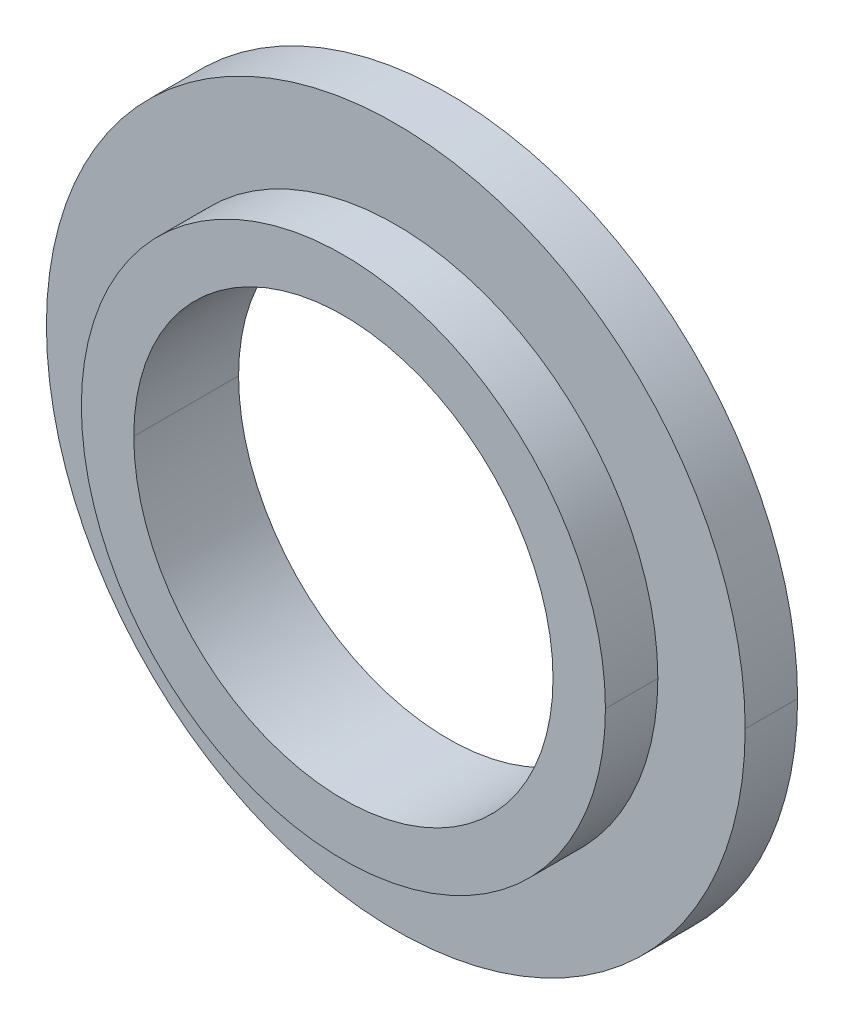
ISO-10303-21;
HEADER;
FILE_DESCRIPTION(('STEP AP214'),'2;1');
FILE_NAME('part.step','',(''),(''),'','','');
FILE_SCHEMA(('AUTOMOTIVE_DESIGN { 1 0 10303 214 1 1 1 1 }'));
ENDSEC;
DATA;
#1=APPLICATION_CONTEXT('core data for automotive mechanical design processes');
#2=APPLICATION_PROTOCOL_DEFINITION('international standard','automotive_design',2000,#1);
#3=PRODUCT_CONTEXT('',#1,'mechanical');
#4=PRODUCT('Part','Part','',(#3));
#5=PRODUCT_RELATED_PRODUCT_CATEGORY('part','',(#4));
#6=PRODUCT_DEFINITION_FORMATION('','',#4);
#7=PRODUCT_DEFINITION_CONTEXT('part definition',#1,'design');
#8=PRODUCT_DEFINITION('design','',#6,#7);
#9=PRODUCT_DEFINITION_SHAPE('','',#8);
#10=(LENGTH_UNIT() NAMED_UNIT(*) SI_UNIT(.MILLI.,.METRE.));
#11=(NAMED_UNIT(*) PLANE_ANGLE_UNIT() SI_UNIT($,.RADIAN.));
#12=(NAMED_UNIT(*) SI_UNIT($,.STERADIAN.) SOLID_ANGLE_UNIT());
#13=UNCERTAINTY_MEASURE_WITH_UNIT(LENGTH_MEASURE(1.E-05),#10,'distance_accuracy_value','');
#14=(GEOMETRIC_REPRESENTATION_CONTEXT(3) GLOBAL_UNCERTAINTY_ASSIGNED_CONTEXT((#13)) GLOBAL_UNIT_ASSIGNED_CONTEXT((#10,
#11,#12)) REPRESENTATION_CONTEXT('',''));
#15=CARTESIAN_POINT('',(0.,0.,0.));
#16=DIRECTION('',(0.,0.,1.));
#17=DIRECTION('',(1.,0.,0.));
#18=AXIS2_PLACEMENT_3D('',#15,#16,#17);
#19=CARTESIAN_POINT('',(0.,0.,3.));
#20=DIRECTION('',(0.,0.,-1.));
#21=DIRECTION('',(-1.,0.,0.));
#22=AXIS2_PLACEMENT_3D('',#19,#20,#21);
#23=CYLINDRICAL_SURFACE('',#22,7.5);
#24=DIRECTION('',(0.,0.,-1.));
#25=VECTOR('',#24,1.);
#26=CARTESIAN_POINT('',(7.5,0.,3.));
#27=LINE('',#26,#25);
#28=CARTESIAN_POINT('',(7.5,0.,3.));
#29=VERTEX_POINT('',#28);
#30=CARTESIAN_POINT('',(7.5,0.,1.5));
#31=VERTEX_POINT('',#30);
#32=EDGE_CURVE('E153',#29,#31,#27,.T.);
#33=ORIENTED_EDGE('',*,*,#32,.F.);
#34=CARTESIAN_POINT('',(0.,0.,3.));
#35=DIRECTION('',(0.,0.,1.));
#36=DIRECTION('',(1.,0.,0.));
#37=AXIS2_PLACEMENT_3D('',#34,#35,#36);
#38=CIRCLE('',#37,7.5);
#39=CARTESIAN_POINT('',(-7.5,0.,3.));
#40=VERTEX_POINT('',#39);
#41=EDGE_CURVE('E11',#40,#29,#38,.T.);
#42=ORIENTED_EDGE('',*,*,#41,.F.);
#43=DIRECTION('',(0.,0.,-1.));
#44=VECTOR('',#43,1.);
#45=CARTESIAN_POINT('',(-7.5,0.,3.));
#46=LINE('',#45,#44);
#47=CARTESIAN_POINT('',(-7.5,0.,1.5));
#48=VERTEX_POINT('',#47);
#49=EDGE_CURVE('E114',#40,#48,#46,.T.);
#50=ORIENTED_EDGE('',*,*,#49,.T.);
#51=CARTESIAN_POINT('',(0.,0.,1.5));
#52=DIRECTION('',(0.,0.,1.));
#53=DIRECTION('',(1.,0.,0.));
#54=AXIS2_PLACEMENT_3D('',#51,#52,#53);
#55=CIRCLE('',#54,7.5);
#56=EDGE_CURVE('E120',#48,#31,#55,.T.);
#57=ORIENTED_EDGE('',*,*,#56,.T.);
#58=EDGE_LOOP('',(#33,#42,#50,#57));
#59=FACE_BOUND('',#58,.T.);
#60=ADVANCED_FACE('F17',(#59),#23,.T.);
#61=CARTESIAN_POINT('',(0.,0.,3.));
#62=DIRECTION('',(0.,0.,1.));
#63=DIRECTION('',(1.,0.,0.));
#64=AXIS2_PLACEMENT_3D('',#61,#62,#63);
#65=PLANE('',#64);
#66=CARTESIAN_POINT('',(0.,0.,3.));
#67=DIRECTION('',(0.,0.,1.));
#68=DIRECTION('',(1.,0.,0.));
#69=AXIS2_PLACEMENT_3D('',#66,#67,#68);
#70=CIRCLE('',#69,6.);
#71=CARTESIAN_POINT('',(-6.,0.,3.));
#72=VERTEX_POINT('',#71);
#73=CARTESIAN_POINT('',(6.,0.,3.));
#74=VERTEX_POINT('',#73);
#75=EDGE_CURVE('E110',#72,#74,#70,.T.);
#76=ORIENTED_EDGE('',*,*,#75,.F.);
#77=CARTESIAN_POINT('',(0.,0.,3.));
#78=DIRECTION('',(0.,0.,1.));
#79=DIRECTION('',(1.,0.,0.));
#80=AXIS2_PLACEMENT_3D('',#77,#78,#79);
#81=CIRCLE('',#80,6.);
#82=EDGE_CURVE('E25',#74,#72,#81,.T.);
#83=ORIENTED_EDGE('',*,*,#82,.F.);
#84=EDGE_LOOP('',(#76,#83));
#85=FACE_BOUND('',#84,.T.);
#86=ORIENTED_EDGE('',*,*,#41,.T.);
#87=CARTESIAN_POINT('',(0.,0.,3.));
#88=DIRECTION('',(0.,0.,1.));
#89=DIRECTION('',(1.,0.,0.));
#90=AXIS2_PLACEMENT_3D('',#87,#88,#89);
#91=CIRCLE('',#90,7.5);
#92=EDGE_CURVE('E146',#29,#40,#91,.T.);
#93=ORIENTED_EDGE('',*,*,#92,.T.);
#94=EDGE_LOOP('',(#86,#93));
#95=FACE_BOUND('',#94,.T.);
#96=ADVANCED_FACE('F142',(#85,#95),#65,.T.);
#97=CARTESIAN_POINT('',(0.,0.,1.5));
#98=DIRECTION('',(0.,0.,-1.));
#99=DIRECTION('',(-1.,0.,0.));
#100=AXIS2_PLACEMENT_3D('',#97,#98,#99);
#101=CYLINDRICAL_SURFACE('',#100,6.);
#102=DIRECTION('',(0.,0.,-1.));
#103=VECTOR('',#102,1.);
#104=CARTESIAN_POINT('',(6.,0.,1.5));
#105=LINE('',#104,#103);
#106=CARTESIAN_POINT('',(6.,0.,0.));
#107=VERTEX_POINT('',#106);
#108=EDGE_CURVE('E95',#74,#107,#105,.T.);
#109=ORIENTED_EDGE('',*,*,#108,.F.);
#110=ORIENTED_EDGE('',*,*,#82,.T.);
#111=DIRECTION('',(0.,0.,-1.));
#112=VECTOR('',#111,1.);
#113=CARTESIAN_POINT('',(-6.,0.,1.5));
#114=LINE('',#113,#112);
#115=CARTESIAN_POINT('',(-6.,0.,0.));
#116=VERTEX_POINT('',#115);
#117=EDGE_CURVE('E92',#72,#116,#114,.T.);
#118=ORIENTED_EDGE('',*,*,#117,.T.);
#119=CARTESIAN_POINT('',(0.,0.,0.));
#120=DIRECTION('',(0.,0.,1.));
#121=DIRECTION('',(1.,0.,0.));
#122=AXIS2_PLACEMENT_3D('',#119,#120,#121);
#123=CIRCLE('',#122,6.);
#124=EDGE_CURVE('E86',#107,#116,#123,.T.);
#125=ORIENTED_EDGE('',*,*,#124,.F.);
#126=EDGE_LOOP('',(#109,#110,#118,#125));
#127=FACE_BOUND('',#126,.T.);
#128=ADVANCED_FACE('F89',(#127),#101,.F.);
#129=CARTESIAN_POINT('',(0.,0.,1.5));
#130=DIRECTION('',(0.,0.,-1.));
#131=DIRECTION('',(-1.,0.,0.));
#132=AXIS2_PLACEMENT_3D('',#129,#130,#131);
#133=CYLINDRICAL_SURFACE('',#132,10.);
#134=DIRECTION('',(0.,0.,-1.));
#135=VECTOR('',#134,1.);
#136=CARTESIAN_POINT('',(10.,0.,1.5));
#137=LINE('',#136,#135);
#138=CARTESIAN_POINT('',(10.,0.,1.5));
#139=VERTEX_POINT('',#138);
#140=CARTESIAN_POINT('',(10.,0.,0.));
#141=VERTEX_POINT('',#140);
#142=EDGE_CURVE('E121',#139,#141,#137,.T.);
#143=ORIENTED_EDGE('',*,*,#142,.F.);
#144=CARTESIAN_POINT('',(0.,0.,1.5));
#145=DIRECTION('',(0.,0.,1.));
#146=DIRECTION('',(1.,0.,0.));
#147=AXIS2_PLACEMENT_3D('',#144,#145,#146);
#148=CIRCLE('',#147,10.);
#149=CARTESIAN_POINT('',(-10.,0.,1.5));
#150=VERTEX_POINT('',#149);
#151=EDGE_CURVE('E124',#150,#139,#148,.T.);
#152=ORIENTED_EDGE('',*,*,#151,.F.);
#153=DIRECTION('',(0.,0.,-1.));
#154=VECTOR('',#153,1.);
#155=CARTESIAN_POINT('',(-10.,0.,1.5));
#156=LINE('',#155,#154);
#157=CARTESIAN_POINT('',(-10.,0.,0.));
#158=VERTEX_POINT('',#157);
#159=EDGE_CURVE('E135',#150,#158,#156,.T.);
#160=ORIENTED_EDGE('',*,*,#159,.T.);
#161=CARTESIAN_POINT('',(0.,0.,0.));
#162=DIRECTION('',(0.,0.,1.));
#163=DIRECTION('',(1.,0.,0.));
#164=AXIS2_PLACEMENT_3D('',#161,#162,#163);
#165=CIRCLE('',#164,10.);
#166=EDGE_CURVE('E40',#158,#141,#165,.T.);
#167=ORIENTED_EDGE('',*,*,#166,.T.);
#168=EDGE_LOOP('',(#143,#152,#160,#167));
#169=FACE_BOUND('',#168,.T.);
#170=ADVANCED_FACE('F185',(#169),#133,.T.);
#171=CARTESIAN_POINT('',(0.,0.,0.));
#172=DIRECTION('',(0.,0.,1.));
#173=DIRECTION('',(1.,0.,0.));
#174=AXIS2_PLACEMENT_3D('',#171,#172,#173);
#175=PLANE('',#174);
#176=CARTESIAN_POINT('',(0.,0.,0.));
#177=DIRECTION('',(0.,0.,1.));
#178=DIRECTION('',(1.,0.,0.));
#179=AXIS2_PLACEMENT_3D('',#176,#177,#178);
#180=CIRCLE('',#179,6.);
#181=EDGE_CURVE('E99',#116,#107,#180,.T.);
#182=ORIENTED_EDGE('',*,*,#181,.T.);
#183=ORIENTED_EDGE('',*,*,#124,.T.);
#184=EDGE_LOOP('',(#182,#183));
#185=FACE_BOUND('',#184,.T.);
#186=ORIENTED_EDGE('',*,*,#166,.F.);
#187=CARTESIAN_POINT('',(0.,0.,0.));
#188=DIRECTION('',(0.,0.,1.));
#189=DIRECTION('',(1.,0.,0.));
#190=AXIS2_PLACEMENT_3D('',#187,#188,#189);
#191=CIRCLE('',#190,10.);
#192=EDGE_CURVE('E126',#141,#158,#191,.T.);
#193=ORIENTED_EDGE('',*,*,#192,.F.);
#194=EDGE_LOOP('',(#186,#193));
#195=FACE_BOUND('',#194,.T.);
#196=ADVANCED_FACE('F101',(#185,#195),#175,.F.);
#197=CARTESIAN_POINT('',(0.,0.,1.5));
#198=DIRECTION('',(0.,0.,1.));
#199=DIRECTION('',(1.,0.,0.));
#200=AXIS2_PLACEMENT_3D('',#197,#198,#199);
#201=PLANE('',#200);
#202=ORIENTED_EDGE('',*,*,#56,.F.);
#203=CARTESIAN_POINT('',(0.,0.,1.5));
#204=DIRECTION('',(0.,0.,1.));
#205=DIRECTION('',(1.,0.,0.));
#206=AXIS2_PLACEMENT_3D('',#203,#204,#205);
#207=CIRCLE('',#206,7.5);
#208=EDGE_CURVE('E158',#31,#48,#207,.T.);
#209=ORIENTED_EDGE('',*,*,#208,.F.);
#210=EDGE_LOOP('',(#202,#209));
#211=FACE_BOUND('',#210,.T.);
#212=ORIENTED_EDGE('',*,*,#151,.T.);
#213=CARTESIAN_POINT('',(0.,0.,1.5));
#214=DIRECTION('',(0.,0.,1.));
#215=DIRECTION('',(1.,0.,0.));
#216=AXIS2_PLACEMENT_3D('',#213,#214,#215);
#217=CIRCLE('',#216,10.);
#218=EDGE_CURVE('E118',#139,#150,#217,.T.);
#219=ORIENTED_EDGE('',*,*,#218,.T.);
#220=EDGE_LOOP('',(#212,#219));
#221=FACE_BOUND('',#220,.T.);
#222=ADVANCED_FACE('F173',(#211,#221),#201,.T.);
#223=CARTESIAN_POINT('',(0.,0.,1.5));
#224=DIRECTION('',(0.,0.,-1.));
#225=DIRECTION('',(-1.,0.,0.));
#226=AXIS2_PLACEMENT_3D('',#223,#224,#225);
#227=CYLINDRICAL_SURFACE('',#226,10.);
#228=ORIENTED_EDGE('',*,*,#218,.F.);
#229=ORIENTED_EDGE('',*,*,#142,.T.);
#230=ORIENTED_EDGE('',*,*,#192,.T.);
#231=ORIENTED_EDGE('',*,*,#159,.F.);
#232=EDGE_LOOP('',(#228,#229,#230,#231));
#233=FACE_BOUND('',#232,.T.);
#234=ADVANCED_FACE('F180',(#233),#227,.T.);
#235=CARTESIAN_POINT('',(0.,0.,1.5));
#236=DIRECTION('',(0.,0.,-1.));
#237=DIRECTION('',(-1.,0.,0.));
#238=AXIS2_PLACEMENT_3D('',#235,#236,#237);
#239=CYLINDRICAL_SURFACE('',#238,6.);
#240=ORIENTED_EDGE('',*,*,#75,.T.);
#241=ORIENTED_EDGE('',*,*,#108,.T.);
#242=ORIENTED_EDGE('',*,*,#181,.F.);
#243=ORIENTED_EDGE('',*,*,#117,.F.);
#244=EDGE_LOOP('',(#240,#241,#242,#243));
#245=FACE_BOUND('',#244,.T.);
#246=ADVANCED_FACE('F104',(#245),#239,.F.);
#247=CARTESIAN_POINT('',(0.,0.,3.));
#248=DIRECTION('',(0.,0.,-1.));
#249=DIRECTION('',(-1.,0.,0.));
#250=AXIS2_PLACEMENT_3D('',#247,#248,#249);
#251=CYLINDRICAL_SURFACE('',#250,7.5);
#252=ORIENTED_EDGE('',*,*,#92,.F.);
#253=ORIENTED_EDGE('',*,*,#32,.T.);
#254=ORIENTED_EDGE('',*,*,#208,.T.);
#255=ORIENTED_EDGE('',*,*,#49,.F.);
#256=EDGE_LOOP('',(#252,#253,#254,#255));
#257=FACE_BOUND('',#256,.T.);
#258=ADVANCED_FACE('F159',(#257),#251,.T.);
#259=CLOSED_SHELL('',(#60,#96,#128,#170,#196,#222,#234,#246,#258));
#260=MANIFOLD_SOLID_BREP('B1',#259);
#261=ADVANCED_BREP_SHAPE_REPRESENTATION('',(#18,#260),#14);
#262=SHAPE_DEFINITION_REPRESENTATION(#9,#261);
ENDSEC;
END-ISO-10303-21;
